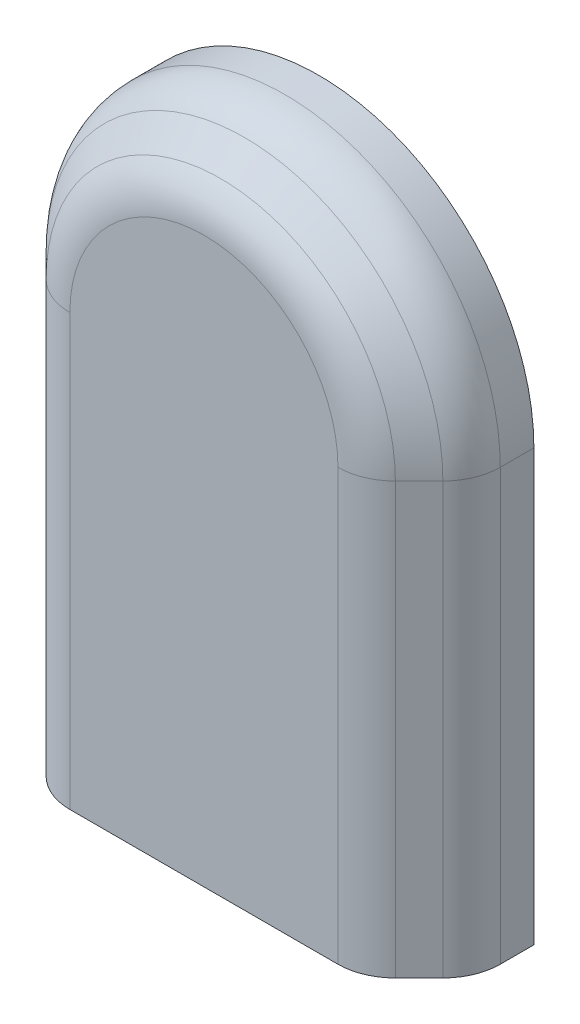
ISO-10303-21;
HEADER;
FILE_DESCRIPTION(('STEP AP214'),'2;1');
FILE_NAME('part.step','',(''),(''),'','','');
FILE_SCHEMA(('AUTOMOTIVE_DESIGN { 1 0 10303 214 1 1 1 1 }'));
ENDSEC;
DATA;
#1=APPLICATION_CONTEXT('core data for automotive mechanical design processes');
#2=APPLICATION_PROTOCOL_DEFINITION('international standard','automotive_design',2000,#1);
#3=PRODUCT_CONTEXT('',#1,'mechanical');
#4=PRODUCT('Part','Part','',(#3));
#5=PRODUCT_RELATED_PRODUCT_CATEGORY('part','',(#4));
#6=PRODUCT_DEFINITION_FORMATION('','',#4);
#7=PRODUCT_DEFINITION_CONTEXT('part definition',#1,'design');
#8=PRODUCT_DEFINITION('design','',#6,#7);
#9=PRODUCT_DEFINITION_SHAPE('','',#8);
#10=(LENGTH_UNIT() NAMED_UNIT(*) SI_UNIT(.MILLI.,.METRE.));
#11=(NAMED_UNIT(*) PLANE_ANGLE_UNIT() SI_UNIT($,.RADIAN.));
#12=(NAMED_UNIT(*) SI_UNIT($,.STERADIAN.) SOLID_ANGLE_UNIT());
#13=UNCERTAINTY_MEASURE_WITH_UNIT(LENGTH_MEASURE(1.E-05),#10,'distance_accuracy_value','');
#14=(GEOMETRIC_REPRESENTATION_CONTEXT(3) GLOBAL_UNCERTAINTY_ASSIGNED_CONTEXT((#13)) GLOBAL_UNIT_ASSIGNED_CONTEXT((#10,
#11,#12)) REPRESENTATION_CONTEXT('',''));
#15=CARTESIAN_POINT('',(0.,0.,0.));
#16=DIRECTION('',(0.,0.,1.));
#17=DIRECTION('',(1.,0.,0.));
#18=AXIS2_PLACEMENT_3D('',#15,#16,#17);
#19=CARTESIAN_POINT('',(0.,0.,20.));
#20=DIRECTION('',(0.,0.,-1.));
#21=DIRECTION('',(-1.,0.,0.));
#22=AXIS2_PLACEMENT_3D('',#19,#20,#21);
#23=CYLINDRICAL_SURFACE('',#22,37.5);
#24=DIRECTION('',(0.,0.,-1.));
#25=VECTOR('',#24,1.);
#26=CARTESIAN_POINT('',(-37.5,0.,20.));
#27=LINE('',#26,#25);
#28=CARTESIAN_POINT('',(-37.5,0.,5.85786437626904));
#29=VERTEX_POINT('',#28);
#30=CARTESIAN_POINT('',(-37.5,0.,0.));
#31=VERTEX_POINT('',#30);
#32=EDGE_CURVE('E140',#29,#31,#27,.T.);
#33=ORIENTED_EDGE('',*,*,#32,.F.);
#34=CARTESIAN_POINT('',(0.,0.,5.85786437626903));
#35=DIRECTION('',(0.,0.,1.));
#36=DIRECTION('',(1.,0.,0.));
#37=AXIS2_PLACEMENT_3D('',#34,#35,#36);
#38=CIRCLE('',#37,37.5);
#39=CARTESIAN_POINT('',(37.5,0.,5.85786437626904));
#40=VERTEX_POINT('',#39);
#41=EDGE_CURVE('E170',#29,#40,#38,.F.);
#42=ORIENTED_EDGE('',*,*,#41,.T.);
#43=DIRECTION('',(0.,0.,-1.));
#44=VECTOR('',#43,1.);
#45=CARTESIAN_POINT('',(37.5,0.,20.));
#46=LINE('',#45,#44);
#47=CARTESIAN_POINT('',(37.5,0.,0.));
#48=VERTEX_POINT('',#47);
#49=EDGE_CURVE('E141',#40,#48,#46,.T.);
#50=ORIENTED_EDGE('',*,*,#49,.T.);
#51=CARTESIAN_POINT('',(0.,0.,0.));
#52=DIRECTION('',(0.,0.,-1.));
#53=DIRECTION('',(-1.,0.,0.));
#54=AXIS2_PLACEMENT_3D('',#51,#52,#53);
#55=CIRCLE('',#54,37.5);
#56=EDGE_CURVE('E144',#31,#48,#55,.T.);
#57=ORIENTED_EDGE('',*,*,#56,.F.);
#58=EDGE_LOOP('',(#33,#42,#50,#57));
#59=FACE_BOUND('',#58,.T.);
#60=ADVANCED_FACE('F41',(#59),#23,.T.);
#61=CARTESIAN_POINT('',(-37.5,0.,20.));
#62=DIRECTION('',(1.,0.,0.));
#63=DIRECTION('',(0.,1.,0.));
#64=AXIS2_PLACEMENT_3D('',#61,#62,#63);
#65=PLANE('',#64);
#66=DIRECTION('',(0.,-1.,0.));
#67=VECTOR('',#66,1.);
#68=CARTESIAN_POINT('',(-37.5,0.,0.));
#69=LINE('',#68,#67);
#70=CARTESIAN_POINT('',(-37.5,-75.,0.));
#71=VERTEX_POINT('',#70);
#72=EDGE_CURVE('E132',#31,#71,#69,.T.);
#73=ORIENTED_EDGE('',*,*,#72,.T.);
#74=DIRECTION('',(0.,0.,1.));
#75=VECTOR('',#74,1.);
#76=CARTESIAN_POINT('',(-37.5,-75.,20.));
#77=LINE('',#76,#75);
#78=CARTESIAN_POINT('',(-37.5,-75.,5.85786437626904));
#79=VERTEX_POINT('',#78);
#80=EDGE_CURVE('E115',#71,#79,#77,.T.);
#81=ORIENTED_EDGE('',*,*,#80,.T.);
#82=DIRECTION('',(0.,-1.,0.));
#83=VECTOR('',#82,1.);
#84=CARTESIAN_POINT('',(-37.5,0.,5.85786437626904));
#85=LINE('',#84,#83);
#86=EDGE_CURVE('E181',#79,#29,#85,.F.);
#87=ORIENTED_EDGE('',*,*,#86,.T.);
#88=ORIENTED_EDGE('',*,*,#32,.T.);
#89=EDGE_LOOP('',(#73,#81,#87,#88));
#90=FACE_BOUND('',#89,.T.);
#91=ADVANCED_FACE('F138',(#90),#65,.F.);
#92=CARTESIAN_POINT('',(37.5,0.,20.));
#93=DIRECTION('',(1.,0.,0.));
#94=DIRECTION('',(0.,1.,0.));
#95=AXIS2_PLACEMENT_3D('',#92,#93,#94);
#96=PLANE('',#95);
#97=DIRECTION('',(0.,0.,1.));
#98=VECTOR('',#97,1.);
#99=CARTESIAN_POINT('',(37.5,-75.,20.));
#100=LINE('',#99,#98);
#101=CARTESIAN_POINT('',(37.5,-75.,0.));
#102=VERTEX_POINT('',#101);
#103=CARTESIAN_POINT('',(37.5,-75.,5.85786437626904));
#104=VERTEX_POINT('',#103);
#105=EDGE_CURVE('E55',#102,#104,#100,.T.);
#106=ORIENTED_EDGE('',*,*,#105,.F.);
#107=DIRECTION('',(0.,-1.,0.));
#108=VECTOR('',#107,1.);
#109=CARTESIAN_POINT('',(37.5,0.,0.));
#110=LINE('',#109,#108);
#111=EDGE_CURVE('E135',#48,#102,#110,.T.);
#112=ORIENTED_EDGE('',*,*,#111,.F.);
#113=ORIENTED_EDGE('',*,*,#49,.F.);
#114=DIRECTION('',(0.,-1.,0.));
#115=VECTOR('',#114,1.);
#116=CARTESIAN_POINT('',(37.5,0.,5.85786437626904));
#117=LINE('',#116,#115);
#118=EDGE_CURVE('E186',#40,#104,#117,.T.);
#119=ORIENTED_EDGE('',*,*,#118,.T.);
#120=EDGE_LOOP('',(#106,#112,#113,#119));
#121=FACE_BOUND('',#120,.T.);
#122=ADVANCED_FACE('F235',(#121),#96,.T.);
#123=CARTESIAN_POINT('',(0.,0.,20.));
#124=DIRECTION('',(0.,0.,-1.));
#125=DIRECTION('',(-1.,0.,0.));
#126=AXIS2_PLACEMENT_3D('',#123,#124,#125);
#127=PLANE('',#126);
#128=DIRECTION('',(0.,1.,0.));
#129=VECTOR('',#128,1.);
#130=CARTESIAN_POINT('',(-23.357864376269,-100.,20.));
#131=LINE('',#130,#129);
#132=CARTESIAN_POINT('',(-23.357864376269,0.,20.));
#133=VERTEX_POINT('',#132);
#134=CARTESIAN_POINT('',(-23.357864376269,-75.,20.));
#135=VERTEX_POINT('',#134);
#136=EDGE_CURVE('E159',#133,#135,#131,.F.);
#137=ORIENTED_EDGE('',*,*,#136,.T.);
#138=DIRECTION('',(1.,0.,0.));
#139=VECTOR('',#138,1.);
#140=CARTESIAN_POINT('',(52.5,-75.,20.));
#141=LINE('',#140,#139);
#142=CARTESIAN_POINT('',(23.3578643762691,-75.,20.));
#143=VERTEX_POINT('',#142);
#144=EDGE_CURVE('E136',#135,#143,#141,.T.);
#145=ORIENTED_EDGE('',*,*,#144,.T.);
#146=DIRECTION('',(0.,1.,0.));
#147=VECTOR('',#146,1.);
#148=CARTESIAN_POINT('',(23.357864376269,0.,20.));
#149=LINE('',#148,#147);
#150=CARTESIAN_POINT('',(23.357864376269,0.,20.));
#151=VERTEX_POINT('',#150);
#152=EDGE_CURVE('E148',#143,#151,#149,.T.);
#153=ORIENTED_EDGE('',*,*,#152,.T.);
#154=CARTESIAN_POINT('',(0.,0.,20.));
#155=DIRECTION('',(0.,0.,-1.));
#156=DIRECTION('',(-1.,0.,0.));
#157=AXIS2_PLACEMENT_3D('',#154,#155,#156);
#158=CIRCLE('',#157,23.357864376269);
#159=EDGE_CURVE('E157',#151,#133,#158,.F.);
#160=ORIENTED_EDGE('',*,*,#159,.T.);
#161=EDGE_LOOP('',(#137,#145,#153,#160));
#162=FACE_BOUND('',#161,.T.);
#163=ADVANCED_FACE('F220',(#162),#127,.F.);
#164=CARTESIAN_POINT('',(0.,0.,0.));
#165=DIRECTION('',(0.,0.,-1.));
#166=DIRECTION('',(-1.,0.,0.));
#167=AXIS2_PLACEMENT_3D('',#164,#165,#166);
#168=PLANE('',#167);
#169=DIRECTION('',(1.,0.,0.));
#170=VECTOR('',#169,1.);
#171=CARTESIAN_POINT('',(52.5,-75.,0.));
#172=LINE('',#171,#170);
#173=EDGE_CURVE('E118',#71,#102,#172,.T.);
#174=ORIENTED_EDGE('',*,*,#173,.F.);
#175=ORIENTED_EDGE('',*,*,#72,.F.);
#176=ORIENTED_EDGE('',*,*,#56,.T.);
#177=ORIENTED_EDGE('',*,*,#111,.T.);
#178=EDGE_LOOP('',(#174,#175,#176,#177));
#179=FACE_BOUND('',#178,.T.);
#180=ADVANCED_FACE('F130',(#179),#168,.T.);
#181=CARTESIAN_POINT('',(-27.5,0.,20.));
#182=DIRECTION('',(0.707106781186548,0.,-0.707106781186546));
#183=DIRECTION('',(0.,-1.,0.));
#184=AXIS2_PLACEMENT_3D('',#181,#182,#183);
#185=PLANE('',#184);
#186=DIRECTION('',(0.707106781186547,0.,0.707106781186549));
#187=VECTOR('',#186,1.);
#188=CARTESIAN_POINT('',(-27.5,-75.,20.));
#189=LINE('',#188,#187);
#190=CARTESIAN_POINT('',(-30.4289321881345,-75.,17.0710678118655));
#191=VERTEX_POINT('',#190);
#192=CARTESIAN_POINT('',(-34.5710678118655,-75.,12.9289321881345));
#193=VERTEX_POINT('',#192);
#194=EDGE_CURVE('E125',#191,#193,#189,.F.);
#195=ORIENTED_EDGE('',*,*,#194,.F.);
#196=DIRECTION('',(0.,-1.,0.));
#197=VECTOR('',#196,1.);
#198=CARTESIAN_POINT('',(-30.4289321881345,0.,17.0710678118655));
#199=LINE('',#198,#197);
#200=CARTESIAN_POINT('',(-30.4289321881345,0.,17.0710678118655));
#201=VERTEX_POINT('',#200);
#202=EDGE_CURVE('E162',#191,#201,#199,.F.);
#203=ORIENTED_EDGE('',*,*,#202,.T.);
#204=DIRECTION('',(0.707106781186546,0.,0.707106781186548));
#205=VECTOR('',#204,1.);
#206=CARTESIAN_POINT('',(-37.5,0.,9.99999999999998));
#207=LINE('',#206,#205);
#208=CARTESIAN_POINT('',(-34.5710678118655,0.,12.9289321881345));
#209=VERTEX_POINT('',#208);
#210=EDGE_CURVE('E152',#209,#201,#207,.T.);
#211=ORIENTED_EDGE('',*,*,#210,.F.);
#212=DIRECTION('',(0.,1.,0.));
#213=VECTOR('',#212,1.);
#214=CARTESIAN_POINT('',(-34.5710678118654,-100.,12.9289321881345));
#215=LINE('',#214,#213);
#216=EDGE_CURVE('E183',#209,#193,#215,.F.);
#217=ORIENTED_EDGE('',*,*,#216,.T.);
#218=EDGE_LOOP('',(#195,#203,#211,#217));
#219=FACE_BOUND('',#218,.T.);
#220=ADVANCED_FACE('F203',(#219),#185,.F.);
#221=CARTESIAN_POINT('',(0.,0.,9.99999999999998));
#222=DIRECTION('',(0.,0.,-1.));
#223=DIRECTION('',(-1.,0.,0.));
#224=AXIS2_PLACEMENT_3D('',#221,#222,#223);
#225=CONICAL_SURFACE('',#224,37.5,0.785398163397447);
#226=DIRECTION('',(-0.707106781186546,0.,0.707106781186548));
#227=VECTOR('',#226,1.);
#228=CARTESIAN_POINT('',(37.5,0.,9.99999999999998));
#229=LINE('',#228,#227);
#230=CARTESIAN_POINT('',(34.5710678118655,0.,12.9289321881345));
#231=VERTEX_POINT('',#230);
#232=CARTESIAN_POINT('',(30.4289321881345,0.,17.0710678118655));
#233=VERTEX_POINT('',#232);
#234=EDGE_CURVE('E150',#231,#233,#229,.T.);
#235=ORIENTED_EDGE('',*,*,#234,.F.);
#236=CARTESIAN_POINT('',(0.,0.,12.9289321881345));
#237=DIRECTION('',(0.,0.,1.));
#238=DIRECTION('',(1.,0.,0.));
#239=AXIS2_PLACEMENT_3D('',#236,#237,#238);
#240=CIRCLE('',#239,34.5710678118655);
#241=EDGE_CURVE('E179',#231,#209,#240,.T.);
#242=ORIENTED_EDGE('',*,*,#241,.T.);
#243=ORIENTED_EDGE('',*,*,#210,.T.);
#244=CARTESIAN_POINT('',(0.,0.,17.0710678118655));
#245=DIRECTION('',(0.,0.,-1.));
#246=DIRECTION('',(-1.,0.,0.));
#247=AXIS2_PLACEMENT_3D('',#244,#245,#246);
#248=CIRCLE('',#247,30.4289321881345);
#249=EDGE_CURVE('E164',#201,#233,#248,.T.);
#250=ORIENTED_EDGE('',*,*,#249,.T.);
#251=EDGE_LOOP('',(#235,#242,#243,#250));
#252=FACE_BOUND('',#251,.T.);
#253=ADVANCED_FACE('F207',(#252),#225,.T.);
#254=CARTESIAN_POINT('',(37.5,0.,9.99999999999998));
#255=DIRECTION('',(0.707106781186548,0.,0.707106781186546));
#256=DIRECTION('',(0.,1.,0.));
#257=AXIS2_PLACEMENT_3D('',#254,#255,#256);
#258=PLANE('',#257);
#259=DIRECTION('',(-0.707106781186547,0.,0.707106781186549));
#260=VECTOR('',#259,1.);
#261=CARTESIAN_POINT('',(37.5,-75.,9.99999999999999));
#262=LINE('',#261,#260);
#263=CARTESIAN_POINT('',(34.5710678118655,-75.,12.9289321881345));
#264=VERTEX_POINT('',#263);
#265=CARTESIAN_POINT('',(30.4289321881345,-75.,17.0710678118655));
#266=VERTEX_POINT('',#265);
#267=EDGE_CURVE('E227',#264,#266,#262,.T.);
#268=ORIENTED_EDGE('',*,*,#267,.F.);
#269=DIRECTION('',(0.,-1.,0.));
#270=VECTOR('',#269,1.);
#271=CARTESIAN_POINT('',(34.5710678118655,0.,12.9289321881345));
#272=LINE('',#271,#270);
#273=EDGE_CURVE('E49',#264,#231,#272,.F.);
#274=ORIENTED_EDGE('',*,*,#273,.T.);
#275=ORIENTED_EDGE('',*,*,#234,.T.);
#276=DIRECTION('',(0.,1.,0.));
#277=VECTOR('',#276,1.);
#278=CARTESIAN_POINT('',(30.4289321881345,-100.,17.0710678118655));
#279=LINE('',#278,#277);
#280=EDGE_CURVE('E167',#233,#266,#279,.F.);
#281=ORIENTED_EDGE('',*,*,#280,.T.);
#282=EDGE_LOOP('',(#268,#274,#275,#281));
#283=FACE_BOUND('',#282,.T.);
#284=ADVANCED_FACE('F226',(#283),#258,.T.);
#285=CARTESIAN_POINT('',(23.357864376269,0.,10.));
#286=DIRECTION('',(0.,-1.,0.));
#287=DIRECTION('',(1.,0.,0.));
#288=AXIS2_PLACEMENT_3D('',#285,#286,#287);
#289=CYLINDRICAL_SURFACE('',#288,10.);
#290=CARTESIAN_POINT('',(23.357864376269,-75.,10.));
#291=DIRECTION('',(0.,1.,0.));
#292=DIRECTION('',(0.,0.,1.));
#293=AXIS2_PLACEMENT_3D('',#290,#291,#292);
#294=CIRCLE('',#293,10.);
#295=EDGE_CURVE('E225',#266,#143,#294,.F.);
#296=ORIENTED_EDGE('',*,*,#295,.F.);
#297=ORIENTED_EDGE('',*,*,#280,.F.);
#298=CARTESIAN_POINT('',(23.357864376269,0.,10.));
#299=DIRECTION('',(0.,1.,0.));
#300=DIRECTION('',(-1.,0.,0.));
#301=AXIS2_PLACEMENT_3D('',#298,#299,#300);
#302=CIRCLE('',#301,10.);
#303=EDGE_CURVE('E153',#151,#233,#302,.T.);
#304=ORIENTED_EDGE('',*,*,#303,.F.);
#305=ORIENTED_EDGE('',*,*,#152,.F.);
#306=EDGE_LOOP('',(#296,#297,#304,#305));
#307=FACE_BOUND('',#306,.T.);
#308=ADVANCED_FACE('F224',(#307),#289,.T.);
#309=CARTESIAN_POINT('',(0.,0.,10.));
#310=DIRECTION('',(0.,0.,-1.));
#311=DIRECTION('',(-1.,0.,0.));
#312=AXIS2_PLACEMENT_3D('',#309,#310,#311);
#313=TOROIDAL_SURFACE('',#312,23.357864376269,10.);
#314=ORIENTED_EDGE('',*,*,#303,.T.);
#315=ORIENTED_EDGE('',*,*,#249,.F.);
#316=CARTESIAN_POINT('',(-23.357864376269,0.,10.));
#317=DIRECTION('',(0.,-1.,0.));
#318=DIRECTION('',(1.,0.,0.));
#319=AXIS2_PLACEMENT_3D('',#316,#317,#318);
#320=CIRCLE('',#319,10.);
#321=EDGE_CURVE('E171',#133,#201,#320,.T.);
#322=ORIENTED_EDGE('',*,*,#321,.F.);
#323=ORIENTED_EDGE('',*,*,#159,.F.);
#324=EDGE_LOOP('',(#314,#315,#322,#323));
#325=FACE_BOUND('',#324,.T.);
#326=ADVANCED_FACE('F211',(#325),#313,.T.);
#327=CARTESIAN_POINT('',(-23.357864376269,0.,10.));
#328=DIRECTION('',(0.,-1.,0.));
#329=DIRECTION('',(1.,0.,0.));
#330=AXIS2_PLACEMENT_3D('',#327,#328,#329);
#331=CYLINDRICAL_SURFACE('',#330,10.);
#332=CARTESIAN_POINT('',(-23.357864376269,-75.,10.));
#333=DIRECTION('',(0.,1.,0.));
#334=DIRECTION('',(0.,0.,1.));
#335=AXIS2_PLACEMENT_3D('',#332,#333,#334);
#336=CIRCLE('',#335,10.);
#337=EDGE_CURVE('E124',#135,#191,#336,.F.);
#338=ORIENTED_EDGE('',*,*,#337,.F.);
#339=ORIENTED_EDGE('',*,*,#136,.F.);
#340=ORIENTED_EDGE('',*,*,#321,.T.);
#341=ORIENTED_EDGE('',*,*,#202,.F.);
#342=EDGE_LOOP('',(#338,#339,#340,#341));
#343=FACE_BOUND('',#342,.T.);
#344=ADVANCED_FACE('F217',(#343),#331,.T.);
#345=CARTESIAN_POINT('',(-27.5,0.,5.85786437626904));
#346=DIRECTION('',(0.,1.,0.));
#347=DIRECTION('',(-1.,0.,0.));
#348=AXIS2_PLACEMENT_3D('',#345,#346,#347);
#349=CYLINDRICAL_SURFACE('',#348,10.);
#350=CARTESIAN_POINT('',(-27.5,-75.,5.85786437626904));
#351=DIRECTION('',(0.,1.,0.));
#352=DIRECTION('',(0.,0.,1.));
#353=AXIS2_PLACEMENT_3D('',#350,#351,#352);
#354=CIRCLE('',#353,10.);
#355=EDGE_CURVE('E120',#193,#79,#354,.F.);
#356=ORIENTED_EDGE('',*,*,#355,.F.);
#357=ORIENTED_EDGE('',*,*,#216,.F.);
#358=CARTESIAN_POINT('',(-27.5,0.,5.85786437626904));
#359=DIRECTION('',(0.,1.,0.));
#360=DIRECTION('',(-1.,0.,0.));
#361=AXIS2_PLACEMENT_3D('',#358,#359,#360);
#362=CIRCLE('',#361,10.);
#363=EDGE_CURVE('E174',#29,#209,#362,.T.);
#364=ORIENTED_EDGE('',*,*,#363,.F.);
#365=ORIENTED_EDGE('',*,*,#86,.F.);
#366=EDGE_LOOP('',(#356,#357,#364,#365));
#367=FACE_BOUND('',#366,.T.);
#368=ADVANCED_FACE('F43',(#367),#349,.T.);
#369=CARTESIAN_POINT('',(27.5,0.,5.85786437626904));
#370=DIRECTION('',(0.,-1.,0.));
#371=DIRECTION('',(1.,0.,0.));
#372=AXIS2_PLACEMENT_3D('',#369,#370,#371);
#373=CYLINDRICAL_SURFACE('',#372,10.);
#374=CARTESIAN_POINT('',(27.5,-75.,5.85786437626904));
#375=DIRECTION('',(0.,1.,0.));
#376=DIRECTION('',(0.,0.,1.));
#377=AXIS2_PLACEMENT_3D('',#374,#375,#376);
#378=CIRCLE('',#377,10.);
#379=EDGE_CURVE('E11',#104,#264,#378,.F.);
#380=ORIENTED_EDGE('',*,*,#379,.F.);
#381=ORIENTED_EDGE('',*,*,#118,.F.);
#382=CARTESIAN_POINT('',(27.5,0.,5.85786437626904));
#383=DIRECTION('',(0.,1.,0.));
#384=DIRECTION('',(-1.,0.,0.));
#385=AXIS2_PLACEMENT_3D('',#382,#383,#384);
#386=CIRCLE('',#385,10.);
#387=EDGE_CURVE('E190',#231,#40,#386,.T.);
#388=ORIENTED_EDGE('',*,*,#387,.F.);
#389=ORIENTED_EDGE('',*,*,#273,.F.);
#390=EDGE_LOOP('',(#380,#381,#388,#389));
#391=FACE_BOUND('',#390,.T.);
#392=ADVANCED_FACE('F230',(#391),#373,.T.);
#393=CARTESIAN_POINT('',(0.,0.,5.85786437626903));
#394=DIRECTION('',(0.,0.,1.));
#395=DIRECTION('',(1.,0.,0.));
#396=AXIS2_PLACEMENT_3D('',#393,#394,#395);
#397=TOROIDAL_SURFACE('',#396,27.5,10.);
#398=ORIENTED_EDGE('',*,*,#363,.T.);
#399=ORIENTED_EDGE('',*,*,#241,.F.);
#400=ORIENTED_EDGE('',*,*,#387,.T.);
#401=ORIENTED_EDGE('',*,*,#41,.F.);
#402=EDGE_LOOP('',(#398,#399,#400,#401));
#403=FACE_BOUND('',#402,.T.);
#404=ADVANCED_FACE('F196',(#403),#397,.T.);
#405=CARTESIAN_POINT('',(52.5,-75.,20.));
#406=DIRECTION('',(0.,1.,0.));
#407=DIRECTION('',(0.,0.,1.));
#408=AXIS2_PLACEMENT_3D('',#405,#406,#407);
#409=PLANE('',#408);
#410=ORIENTED_EDGE('',*,*,#337,.T.);
#411=ORIENTED_EDGE('',*,*,#194,.T.);
#412=ORIENTED_EDGE('',*,*,#355,.T.);
#413=ORIENTED_EDGE('',*,*,#80,.F.);
#414=ORIENTED_EDGE('',*,*,#173,.T.);
#415=ORIENTED_EDGE('',*,*,#105,.T.);
#416=ORIENTED_EDGE('',*,*,#379,.T.);
#417=ORIENTED_EDGE('',*,*,#267,.T.);
#418=ORIENTED_EDGE('',*,*,#295,.T.);
#419=ORIENTED_EDGE('',*,*,#144,.F.);
#420=EDGE_LOOP('',(#410,#411,#412,#413,#414,#415,#416,#417,#418,#419));
#421=FACE_BOUND('',#420,.T.);
#422=ADVANCED_FACE('F117',(#421),#409,.F.);
#423=CLOSED_SHELL('',(#60,#91,#122,#163,#180,#220,#253,#284,#308,#326,#344,#368,#392,#404,#422));
#424=MANIFOLD_SOLID_BREP('B2',#423);
#425=ADVANCED_BREP_SHAPE_REPRESENTATION('',(#18,#424),#14);
#426=SHAPE_DEFINITION_REPRESENTATION(#9,#425);
ENDSEC;
END-ISO-10303-21;
